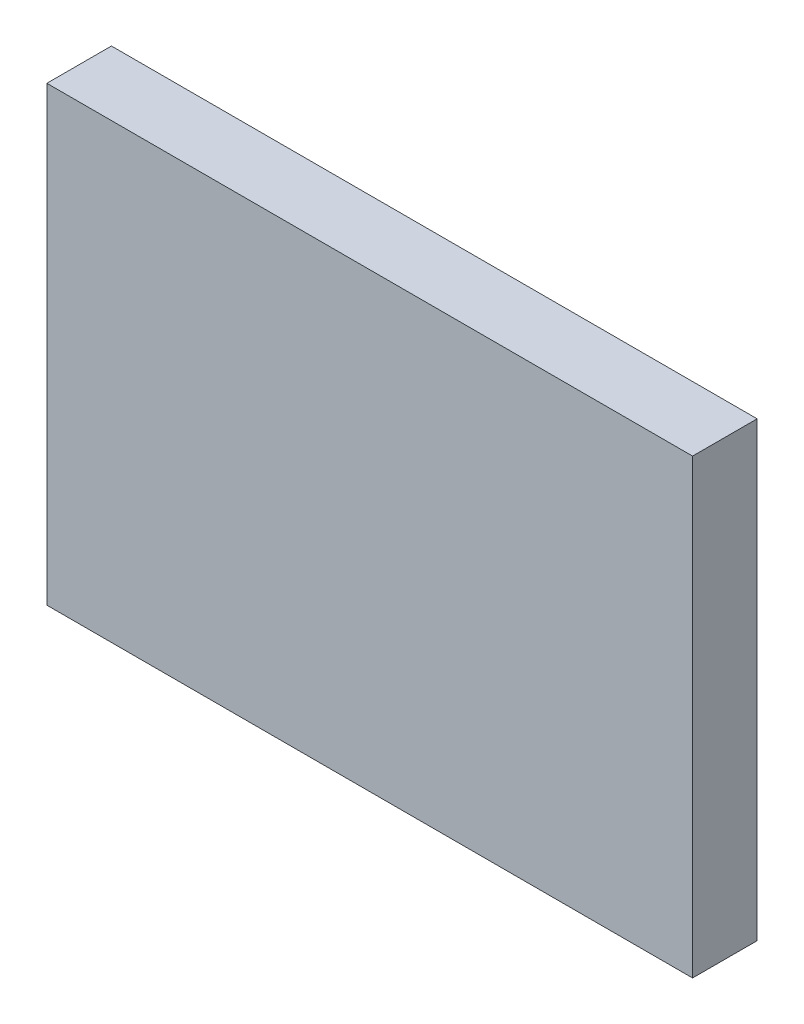
ISO-10303-21;
HEADER;
FILE_DESCRIPTION(('STEP AP214'),'2;1');
FILE_NAME('part.step','',(''),(''),'','','');
FILE_SCHEMA(('AUTOMOTIVE_DESIGN { 1 0 10303 214 1 1 1 1 }'));
ENDSEC;
DATA;
#1=APPLICATION_CONTEXT('core data for automotive mechanical design processes');
#2=APPLICATION_PROTOCOL_DEFINITION('international standard','automotive_design',2000,#1);
#3=PRODUCT_CONTEXT('',#1,'mechanical');
#4=PRODUCT('Part','Part','',(#3));
#5=PRODUCT_RELATED_PRODUCT_CATEGORY('part','',(#4));
#6=PRODUCT_DEFINITION_FORMATION('','',#4);
#7=PRODUCT_DEFINITION_CONTEXT('part definition',#1,'design');
#8=PRODUCT_DEFINITION('design','',#6,#7);
#9=PRODUCT_DEFINITION_SHAPE('','',#8);
#10=(LENGTH_UNIT() NAMED_UNIT(*) SI_UNIT(.MILLI.,.METRE.));
#11=(NAMED_UNIT(*) PLANE_ANGLE_UNIT() SI_UNIT($,.RADIAN.));
#12=(NAMED_UNIT(*) SI_UNIT($,.STERADIAN.) SOLID_ANGLE_UNIT());
#13=UNCERTAINTY_MEASURE_WITH_UNIT(LENGTH_MEASURE(1.E-05),#10,'distance_accuracy_value','');
#14=(GEOMETRIC_REPRESENTATION_CONTEXT(3) GLOBAL_UNCERTAINTY_ASSIGNED_CONTEXT((#13)) GLOBAL_UNIT_ASSIGNED_CONTEXT((#10,
#11,#12)) REPRESENTATION_CONTEXT('',''));
#15=CARTESIAN_POINT('',(0.,0.,0.));
#16=DIRECTION('',(0.,0.,1.));
#17=DIRECTION('',(1.,0.,0.));
#18=AXIS2_PLACEMENT_3D('',#15,#16,#17);
#19=CARTESIAN_POINT('',(5.,-3.5,1.));
#20=DIRECTION('',(-1.,0.,0.));
#21=DIRECTION('',(0.,0.,1.));
#22=AXIS2_PLACEMENT_3D('',#19,#20,#21);
#23=PLANE('',#22);
#24=DIRECTION('',(0.,1.,0.));
#25=VECTOR('',#24,1.);
#26=CARTESIAN_POINT('',(5.,-3.5,0.));
#27=LINE('',#26,#25);
#28=CARTESIAN_POINT('',(5.,-3.5,0.));
#29=VERTEX_POINT('',#28);
#30=CARTESIAN_POINT('',(5.,3.5,0.));
#31=VERTEX_POINT('',#30);
#32=EDGE_CURVE('E102',#29,#31,#27,.T.);
#33=ORIENTED_EDGE('',*,*,#32,.T.);
#34=DIRECTION('',(0.,0.,-1.));
#35=VECTOR('',#34,1.);
#36=CARTESIAN_POINT('',(5.,3.5,1.));
#37=LINE('',#36,#35);
#38=CARTESIAN_POINT('',(5.,3.5,1.));
#39=VERTEX_POINT('',#38);
#40=EDGE_CURVE('E11',#39,#31,#37,.T.);
#41=ORIENTED_EDGE('',*,*,#40,.F.);
#42=DIRECTION('',(0.,1.,0.));
#43=VECTOR('',#42,1.);
#44=CARTESIAN_POINT('',(5.,-3.5,1.));
#45=LINE('',#44,#43);
#46=CARTESIAN_POINT('',(5.,-3.5,1.));
#47=VERTEX_POINT('',#46);
#48=EDGE_CURVE('E90',#47,#39,#45,.T.);
#49=ORIENTED_EDGE('',*,*,#48,.F.);
#50=DIRECTION('',(0.,0.,-1.));
#51=VECTOR('',#50,1.);
#52=CARTESIAN_POINT('',(5.,-3.5,1.));
#53=LINE('',#52,#51);
#54=EDGE_CURVE('E98',#47,#29,#53,.T.);
#55=ORIENTED_EDGE('',*,*,#54,.T.);
#56=EDGE_LOOP('',(#33,#41,#49,#55));
#57=FACE_BOUND('',#56,.T.);
#58=ADVANCED_FACE('F39',(#57),#23,.F.);
#59=CARTESIAN_POINT('',(-5.,3.5,1.));
#60=DIRECTION('',(0.,-1.,0.));
#61=DIRECTION('',(0.,0.,-1.));
#62=AXIS2_PLACEMENT_3D('',#59,#60,#61);
#63=PLANE('',#62);
#64=DIRECTION('',(-1.,0.,0.));
#65=VECTOR('',#64,1.);
#66=CARTESIAN_POINT('',(-5.,3.5,0.));
#67=LINE('',#66,#65);
#68=CARTESIAN_POINT('',(-5.,3.5,0.));
#69=VERTEX_POINT('',#68);
#70=EDGE_CURVE('E94',#31,#69,#67,.T.);
#71=ORIENTED_EDGE('',*,*,#70,.T.);
#72=DIRECTION('',(0.,0.,-1.));
#73=VECTOR('',#72,1.);
#74=CARTESIAN_POINT('',(-5.,3.5,1.));
#75=LINE('',#74,#73);
#76=CARTESIAN_POINT('',(-5.,3.5,1.));
#77=VERTEX_POINT('',#76);
#78=EDGE_CURVE('E47',#77,#69,#75,.T.);
#79=ORIENTED_EDGE('',*,*,#78,.F.);
#80=DIRECTION('',(-1.,0.,0.));
#81=VECTOR('',#80,1.);
#82=CARTESIAN_POINT('',(-5.,3.5,1.));
#83=LINE('',#82,#81);
#84=EDGE_CURVE('E85',#39,#77,#83,.T.);
#85=ORIENTED_EDGE('',*,*,#84,.F.);
#86=ORIENTED_EDGE('',*,*,#40,.T.);
#87=EDGE_LOOP('',(#71,#79,#85,#86));
#88=FACE_BOUND('',#87,.T.);
#89=ADVANCED_FACE('F93',(#88),#63,.F.);
#90=CARTESIAN_POINT('',(-5.,-3.5,1.));
#91=DIRECTION('',(1.,0.,0.));
#92=DIRECTION('',(0.,0.,-1.));
#93=AXIS2_PLACEMENT_3D('',#90,#91,#92);
#94=PLANE('',#93);
#95=DIRECTION('',(0.,-1.,0.));
#96=VECTOR('',#95,1.);
#97=CARTESIAN_POINT('',(-5.,-3.5,0.));
#98=LINE('',#97,#96);
#99=CARTESIAN_POINT('',(-5.,-3.5,0.));
#100=VERTEX_POINT('',#99);
#101=EDGE_CURVE('E72',#69,#100,#98,.T.);
#102=ORIENTED_EDGE('',*,*,#101,.T.);
#103=DIRECTION('',(0.,0.,-1.));
#104=VECTOR('',#103,1.);
#105=CARTESIAN_POINT('',(-5.,-3.5,1.));
#106=LINE('',#105,#104);
#107=CARTESIAN_POINT('',(-5.,-3.5,1.));
#108=VERTEX_POINT('',#107);
#109=EDGE_CURVE('E95',#108,#100,#106,.T.);
#110=ORIENTED_EDGE('',*,*,#109,.F.);
#111=DIRECTION('',(0.,-1.,0.));
#112=VECTOR('',#111,1.);
#113=CARTESIAN_POINT('',(-5.,-3.5,1.));
#114=LINE('',#113,#112);
#115=EDGE_CURVE('E88',#77,#108,#114,.T.);
#116=ORIENTED_EDGE('',*,*,#115,.F.);
#117=ORIENTED_EDGE('',*,*,#78,.T.);
#118=EDGE_LOOP('',(#102,#110,#116,#117));
#119=FACE_BOUND('',#118,.T.);
#120=ADVANCED_FACE('F96',(#119),#94,.F.);
#121=CARTESIAN_POINT('',(-5.,-3.5,1.));
#122=DIRECTION('',(0.,1.,0.));
#123=DIRECTION('',(0.,0.,1.));
#124=AXIS2_PLACEMENT_3D('',#121,#122,#123);
#125=PLANE('',#124);
#126=DIRECTION('',(1.,0.,0.));
#127=VECTOR('',#126,1.);
#128=CARTESIAN_POINT('',(-5.,-3.5,0.));
#129=LINE('',#128,#127);
#130=EDGE_CURVE('E78',#100,#29,#129,.T.);
#131=ORIENTED_EDGE('',*,*,#130,.T.);
#132=ORIENTED_EDGE('',*,*,#54,.F.);
#133=DIRECTION('',(1.,0.,0.));
#134=VECTOR('',#133,1.);
#135=CARTESIAN_POINT('',(-5.,-3.5,1.));
#136=LINE('',#135,#134);
#137=EDGE_CURVE('E55',#108,#47,#136,.T.);
#138=ORIENTED_EDGE('',*,*,#137,.F.);
#139=ORIENTED_EDGE('',*,*,#109,.T.);
#140=EDGE_LOOP('',(#131,#132,#138,#139));
#141=FACE_BOUND('',#140,.T.);
#142=ADVANCED_FACE('F109',(#141),#125,.F.);
#143=CARTESIAN_POINT('',(0.,0.,1.));
#144=DIRECTION('',(0.,0.,-1.));
#145=DIRECTION('',(-1.,0.,0.));
#146=AXIS2_PLACEMENT_3D('',#143,#144,#145);
#147=PLANE('',#146);
#148=ORIENTED_EDGE('',*,*,#48,.T.);
#149=ORIENTED_EDGE('',*,*,#84,.T.);
#150=ORIENTED_EDGE('',*,*,#115,.T.);
#151=ORIENTED_EDGE('',*,*,#137,.T.);
#152=EDGE_LOOP('',(#148,#149,#150,#151));
#153=FACE_BOUND('',#152,.T.);
#154=ADVANCED_FACE('F86',(#153),#147,.F.);
#155=CARTESIAN_POINT('',(0.,0.,0.));
#156=DIRECTION('',(0.,0.,-1.));
#157=DIRECTION('',(-1.,0.,0.));
#158=AXIS2_PLACEMENT_3D('',#155,#156,#157);
#159=PLANE('',#158);
#160=ORIENTED_EDGE('',*,*,#32,.F.);
#161=ORIENTED_EDGE('',*,*,#130,.F.);
#162=ORIENTED_EDGE('',*,*,#101,.F.);
#163=ORIENTED_EDGE('',*,*,#70,.F.);
#164=EDGE_LOOP('',(#160,#161,#162,#163));
#165=FACE_BOUND('',#164,.T.);
#166=ADVANCED_FACE('F112',(#165),#159,.T.);
#167=CLOSED_SHELL('',(#58,#89,#120,#142,#154,#166));
#168=MANIFOLD_SOLID_BREP('B2',#167);
#169=ADVANCED_BREP_SHAPE_REPRESENTATION('',(#18,#168),#14);
#170=SHAPE_DEFINITION_REPRESENTATION(#9,#169);
ENDSEC;
END-ISO-10303-21;
